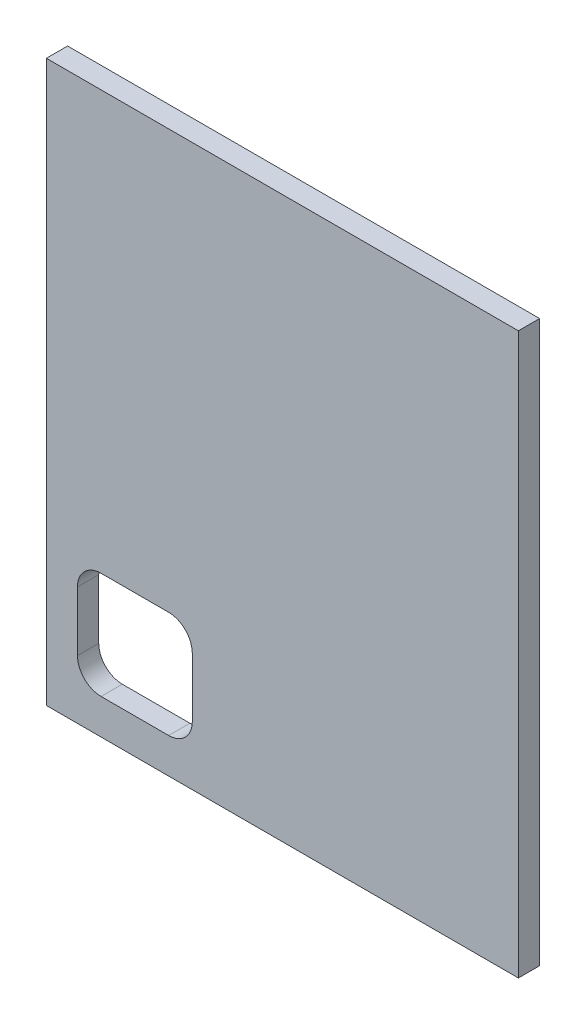
ISO-10303-21;
HEADER;
FILE_DESCRIPTION(('STEP AP214'),'2;1');
FILE_NAME('part.step','',(''),(''),'','','');
FILE_SCHEMA(('AUTOMOTIVE_DESIGN { 1 0 10303 214 1 1 1 1 }'));
ENDSEC;
DATA;
#1=APPLICATION_CONTEXT('core data for automotive mechanical design processes');
#2=APPLICATION_PROTOCOL_DEFINITION('international standard','automotive_design',2000,#1);
#3=PRODUCT_CONTEXT('',#1,'mechanical');
#4=PRODUCT('Part','Part','',(#3));
#5=PRODUCT_RELATED_PRODUCT_CATEGORY('part','',(#4));
#6=PRODUCT_DEFINITION_FORMATION('','',#4);
#7=PRODUCT_DEFINITION_CONTEXT('part definition',#1,'design');
#8=PRODUCT_DEFINITION('design','',#6,#7);
#9=PRODUCT_DEFINITION_SHAPE('','',#8);
#10=(LENGTH_UNIT() NAMED_UNIT(*) SI_UNIT(.MILLI.,.METRE.));
#11=(NAMED_UNIT(*) PLANE_ANGLE_UNIT() SI_UNIT($,.RADIAN.));
#12=(NAMED_UNIT(*) SI_UNIT($,.STERADIAN.) SOLID_ANGLE_UNIT());
#13=UNCERTAINTY_MEASURE_WITH_UNIT(LENGTH_MEASURE(1.E-05),#10,'distance_accuracy_value','');
#14=(GEOMETRIC_REPRESENTATION_CONTEXT(3) GLOBAL_UNCERTAINTY_ASSIGNED_CONTEXT((#13)) GLOBAL_UNIT_ASSIGNED_CONTEXT((#10,
#11,#12)) REPRESENTATION_CONTEXT('',''));
#15=CARTESIAN_POINT('',(0.,0.,0.));
#16=DIRECTION('',(0.,0.,1.));
#17=DIRECTION('',(1.,0.,0.));
#18=AXIS2_PLACEMENT_3D('',#15,#16,#17);
#19=CARTESIAN_POINT('',(0.,0.,-2.286));
#20=DIRECTION('',(-1.,0.,0.));
#21=DIRECTION('',(0.,0.,1.));
#22=AXIS2_PLACEMENT_3D('',#19,#20,#21);
#23=PLANE('',#22);
#24=DIRECTION('',(0.,-1.,0.));
#25=VECTOR('',#24,1.);
#26=CARTESIAN_POINT('',(0.,0.,0.));
#27=LINE('',#26,#25);
#28=CARTESIAN_POINT('',(0.,60.325,0.));
#29=VERTEX_POINT('',#28);
#30=CARTESIAN_POINT('',(0.,0.,0.));
#31=VERTEX_POINT('',#30);
#32=EDGE_CURVE('E177',#29,#31,#27,.T.);
#33=ORIENTED_EDGE('',*,*,#32,.F.);
#34=DIRECTION('',(0.,0.,1.));
#35=VECTOR('',#34,1.);
#36=CARTESIAN_POINT('',(0.,60.325,-2.286));
#37=LINE('',#36,#35);
#38=CARTESIAN_POINT('',(0.,60.325,-2.286));
#39=VERTEX_POINT('',#38);
#40=EDGE_CURVE('E11',#39,#29,#37,.T.);
#41=ORIENTED_EDGE('',*,*,#40,.F.);
#42=DIRECTION('',(0.,-1.,0.));
#43=VECTOR('',#42,1.);
#44=CARTESIAN_POINT('',(0.,0.,-2.286));
#45=LINE('',#44,#43);
#46=CARTESIAN_POINT('',(0.,0.,-2.286));
#47=VERTEX_POINT('',#46);
#48=EDGE_CURVE('E189',#39,#47,#45,.T.);
#49=ORIENTED_EDGE('',*,*,#48,.T.);
#50=DIRECTION('',(0.,0.,1.));
#51=VECTOR('',#50,1.);
#52=CARTESIAN_POINT('',(0.,0.,-2.286));
#53=LINE('',#52,#51);
#54=EDGE_CURVE('E34',#47,#31,#53,.T.);
#55=ORIENTED_EDGE('',*,*,#54,.T.);
#56=EDGE_LOOP('',(#33,#41,#49,#55));
#57=FACE_BOUND('',#56,.T.);
#58=ADVANCED_FACE('F31',(#57),#23,.T.);
#59=CARTESIAN_POINT('',(0.,60.325,-2.286));
#60=DIRECTION('',(0.,1.,0.));
#61=DIRECTION('',(0.,0.,1.));
#62=AXIS2_PLACEMENT_3D('',#59,#60,#61);
#63=PLANE('',#62);
#64=DIRECTION('',(-1.,0.,0.));
#65=VECTOR('',#64,1.);
#66=CARTESIAN_POINT('',(0.,60.325,0.));
#67=LINE('',#66,#65);
#68=CARTESIAN_POINT('',(50.8,60.325,0.));
#69=VERTEX_POINT('',#68);
#70=EDGE_CURVE('E193',#69,#29,#67,.T.);
#71=ORIENTED_EDGE('',*,*,#70,.F.);
#72=DIRECTION('',(0.,0.,1.));
#73=VECTOR('',#72,1.);
#74=CARTESIAN_POINT('',(50.8,60.325,-2.286));
#75=LINE('',#74,#73);
#76=CARTESIAN_POINT('',(50.8,60.325,-2.286));
#77=VERTEX_POINT('',#76);
#78=EDGE_CURVE('E39',#77,#69,#75,.T.);
#79=ORIENTED_EDGE('',*,*,#78,.F.);
#80=DIRECTION('',(-1.,0.,0.));
#81=VECTOR('',#80,1.);
#82=CARTESIAN_POINT('',(0.,60.325,-2.286));
#83=LINE('',#82,#81);
#84=EDGE_CURVE('E199',#77,#39,#83,.T.);
#85=ORIENTED_EDGE('',*,*,#84,.T.);
#86=ORIENTED_EDGE('',*,*,#40,.T.);
#87=EDGE_LOOP('',(#71,#79,#85,#86));
#88=FACE_BOUND('',#87,.T.);
#89=ADVANCED_FACE('F225',(#88),#63,.T.);
#90=CARTESIAN_POINT('',(50.8,0.,-2.286));
#91=DIRECTION('',(1.,0.,0.));
#92=DIRECTION('',(0.,0.,-1.));
#93=AXIS2_PLACEMENT_3D('',#90,#91,#92);
#94=PLANE('',#93);
#95=DIRECTION('',(0.,1.,0.));
#96=VECTOR('',#95,1.);
#97=CARTESIAN_POINT('',(50.8,0.,0.));
#98=LINE('',#97,#96);
#99=CARTESIAN_POINT('',(50.8,0.,0.));
#100=VERTEX_POINT('',#99);
#101=EDGE_CURVE('E207',#100,#69,#98,.T.);
#102=ORIENTED_EDGE('',*,*,#101,.F.);
#103=DIRECTION('',(0.,0.,1.));
#104=VECTOR('',#103,1.);
#105=CARTESIAN_POINT('',(50.8,0.,-2.286));
#106=LINE('',#105,#104);
#107=CARTESIAN_POINT('',(50.8,0.,-2.286));
#108=VERTEX_POINT('',#107);
#109=EDGE_CURVE('E212',#108,#100,#106,.T.);
#110=ORIENTED_EDGE('',*,*,#109,.F.);
#111=DIRECTION('',(0.,1.,0.));
#112=VECTOR('',#111,1.);
#113=CARTESIAN_POINT('',(50.8,0.,-2.286));
#114=LINE('',#113,#112);
#115=EDGE_CURVE('E196',#108,#77,#114,.T.);
#116=ORIENTED_EDGE('',*,*,#115,.T.);
#117=ORIENTED_EDGE('',*,*,#78,.T.);
#118=EDGE_LOOP('',(#102,#110,#116,#117));
#119=FACE_BOUND('',#118,.T.);
#120=ADVANCED_FACE('F229',(#119),#94,.T.);
#121=CARTESIAN_POINT('',(0.,0.,-2.286));
#122=DIRECTION('',(0.,-1.,0.));
#123=DIRECTION('',(0.,0.,-1.));
#124=AXIS2_PLACEMENT_3D('',#121,#122,#123);
#125=PLANE('',#124);
#126=DIRECTION('',(1.,0.,0.));
#127=VECTOR('',#126,1.);
#128=CARTESIAN_POINT('',(0.,0.,0.));
#129=LINE('',#128,#127);
#130=EDGE_CURVE('E204',#31,#100,#129,.T.);
#131=ORIENTED_EDGE('',*,*,#130,.F.);
#132=ORIENTED_EDGE('',*,*,#54,.F.);
#133=DIRECTION('',(1.,0.,0.));
#134=VECTOR('',#133,1.);
#135=CARTESIAN_POINT('',(0.,0.,-2.286));
#136=LINE('',#135,#134);
#137=EDGE_CURVE('E192',#47,#108,#136,.T.);
#138=ORIENTED_EDGE('',*,*,#137,.T.);
#139=ORIENTED_EDGE('',*,*,#109,.T.);
#140=EDGE_LOOP('',(#131,#132,#138,#139));
#141=FACE_BOUND('',#140,.T.);
#142=ADVANCED_FACE('F220',(#141),#125,.T.);
#143=CARTESIAN_POINT('',(0.,60.325,-2.286));
#144=DIRECTION('',(0.,0.,-1.));
#145=DIRECTION('',(-1.,0.,0.));
#146=AXIS2_PLACEMENT_3D('',#143,#144,#145);
#147=PLANE('',#146);
#148=CARTESIAN_POINT('',(13.163134915622,12.7248083662196,-2.286));
#149=DIRECTION('',(0.,0.,1.));
#150=DIRECTION('',(-1.,0.,0.));
#151=AXIS2_PLACEMENT_3D('',#148,#149,#150);
#152=CIRCLE('',#151,2.54);
#153=CARTESIAN_POINT('',(15.703134915622,12.7248083662196,-2.286));
#154=VERTEX_POINT('',#153);
#155=CARTESIAN_POINT('',(13.163134915622,15.2648083662196,-2.286));
#156=VERTEX_POINT('',#155);
#157=EDGE_CURVE('E122',#154,#156,#152,.T.);
#158=ORIENTED_EDGE('',*,*,#157,.T.);
#159=DIRECTION('',(-1.,0.,0.));
#160=VECTOR('',#159,1.);
#161=CARTESIAN_POINT('',(5.88686508437798,15.2648083662196,-2.286));
#162=LINE('',#161,#160);
#163=CARTESIAN_POINT('',(5.88686508437798,15.2648083662196,-2.286));
#164=VERTEX_POINT('',#163);
#165=EDGE_CURVE('E131',#156,#164,#162,.T.);
#166=ORIENTED_EDGE('',*,*,#165,.T.);
#167=CARTESIAN_POINT('',(5.88686508437796,12.7248083662196,-2.286));
#168=DIRECTION('',(0.,0.,1.));
#169=DIRECTION('',(-1.,0.,0.));
#170=AXIS2_PLACEMENT_3D('',#167,#168,#169);
#171=CIRCLE('',#170,2.54);
#172=CARTESIAN_POINT('',(3.34686508437796,12.7248083662196,-2.286));
#173=VERTEX_POINT('',#172);
#174=EDGE_CURVE('E47',#164,#173,#171,.T.);
#175=ORIENTED_EDGE('',*,*,#174,.T.);
#176=DIRECTION('',(0.,-1.,0.));
#177=VECTOR('',#176,1.);
#178=CARTESIAN_POINT('',(3.34686508437796,12.7248083662196,-2.286));
#179=LINE('',#178,#177);
#180=CARTESIAN_POINT('',(3.34686508437796,6.32519163378041,-2.286));
#181=VERTEX_POINT('',#180);
#182=EDGE_CURVE('E146',#173,#181,#179,.T.);
#183=ORIENTED_EDGE('',*,*,#182,.T.);
#184=CARTESIAN_POINT('',(5.88686508437796,6.3251916337804,-2.286));
#185=DIRECTION('',(0.,0.,1.));
#186=DIRECTION('',(-1.,0.,0.));
#187=AXIS2_PLACEMENT_3D('',#184,#185,#186);
#188=CIRCLE('',#187,2.54);
#189=CARTESIAN_POINT('',(5.88686508437798,3.7851916337804,-2.286));
#190=VERTEX_POINT('',#189);
#191=EDGE_CURVE('E149',#181,#190,#188,.T.);
#192=ORIENTED_EDGE('',*,*,#191,.T.);
#193=DIRECTION('',(1.,0.,0.));
#194=VECTOR('',#193,1.);
#195=CARTESIAN_POINT('',(5.88686508437798,3.7851916337804,-2.286));
#196=LINE('',#195,#194);
#197=CARTESIAN_POINT('',(13.163134915622,3.7851916337804,-2.286));
#198=VERTEX_POINT('',#197);
#199=EDGE_CURVE('E152',#190,#198,#196,.T.);
#200=ORIENTED_EDGE('',*,*,#199,.T.);
#201=CARTESIAN_POINT('',(13.163134915622,6.3251916337804,-2.286));
#202=DIRECTION('',(0.,0.,1.));
#203=DIRECTION('',(-1.,0.,0.));
#204=AXIS2_PLACEMENT_3D('',#201,#202,#203);
#205=CIRCLE('',#204,2.54);
#206=CARTESIAN_POINT('',(15.703134915622,6.32519163378041,-2.286));
#207=VERTEX_POINT('',#206);
#208=EDGE_CURVE('E155',#198,#207,#205,.T.);
#209=ORIENTED_EDGE('',*,*,#208,.T.);
#210=DIRECTION('',(0.,1.,0.));
#211=VECTOR('',#210,1.);
#212=CARTESIAN_POINT('',(15.703134915622,12.7248083662196,-2.286));
#213=LINE('',#212,#211);
#214=EDGE_CURVE('E128',#207,#154,#213,.T.);
#215=ORIENTED_EDGE('',*,*,#214,.T.);
#216=EDGE_LOOP('',(#158,#166,#175,#183,#192,#200,#209,#215));
#217=FACE_BOUND('',#216,.T.);
#218=ORIENTED_EDGE('',*,*,#48,.F.);
#219=ORIENTED_EDGE('',*,*,#84,.F.);
#220=ORIENTED_EDGE('',*,*,#115,.F.);
#221=ORIENTED_EDGE('',*,*,#137,.F.);
#222=EDGE_LOOP('',(#218,#219,#220,#221));
#223=FACE_BOUND('',#222,.T.);
#224=ADVANCED_FACE('F135',(#217,#223),#147,.T.);
#225=CARTESIAN_POINT('',(0.,60.325,0.));
#226=DIRECTION('',(0.,0.,-1.));
#227=DIRECTION('',(-1.,0.,0.));
#228=AXIS2_PLACEMENT_3D('',#225,#226,#227);
#229=PLANE('',#228);
#230=DIRECTION('',(-1.,0.,0.));
#231=VECTOR('',#230,1.);
#232=CARTESIAN_POINT('',(5.88686508437798,15.2648083662196,0.));
#233=LINE('',#232,#231);
#234=CARTESIAN_POINT('',(13.163134915622,15.2648083662196,0.));
#235=VERTEX_POINT('',#234);
#236=CARTESIAN_POINT('',(5.88686508437798,15.2648083662196,0.));
#237=VERTEX_POINT('',#236);
#238=EDGE_CURVE('E159',#235,#237,#233,.T.);
#239=ORIENTED_EDGE('',*,*,#238,.F.);
#240=CARTESIAN_POINT('',(13.163134915622,12.7248083662196,0.));
#241=DIRECTION('',(0.,0.,1.));
#242=DIRECTION('',(-1.,0.,0.));
#243=AXIS2_PLACEMENT_3D('',#240,#241,#242);
#244=CIRCLE('',#243,2.54);
#245=CARTESIAN_POINT('',(15.703134915622,12.7248083662196,0.));
#246=VERTEX_POINT('',#245);
#247=EDGE_CURVE('E55',#246,#235,#244,.T.);
#248=ORIENTED_EDGE('',*,*,#247,.F.);
#249=DIRECTION('',(0.,1.,0.));
#250=VECTOR('',#249,1.);
#251=CARTESIAN_POINT('',(15.703134915622,12.7248083662196,0.));
#252=LINE('',#251,#250);
#253=CARTESIAN_POINT('',(15.703134915622,6.32519163378041,0.));
#254=VERTEX_POINT('',#253);
#255=EDGE_CURVE('E139',#254,#246,#252,.T.);
#256=ORIENTED_EDGE('',*,*,#255,.F.);
#257=CARTESIAN_POINT('',(13.163134915622,6.3251916337804,0.));
#258=DIRECTION('',(0.,0.,1.));
#259=DIRECTION('',(-1.,0.,0.));
#260=AXIS2_PLACEMENT_3D('',#257,#258,#259);
#261=CIRCLE('',#260,2.54);
#262=CARTESIAN_POINT('',(13.163134915622,3.7851916337804,0.));
#263=VERTEX_POINT('',#262);
#264=EDGE_CURVE('E142',#263,#254,#261,.T.);
#265=ORIENTED_EDGE('',*,*,#264,.F.);
#266=DIRECTION('',(1.,0.,0.));
#267=VECTOR('',#266,1.);
#268=CARTESIAN_POINT('',(5.88686508437798,3.7851916337804,0.));
#269=LINE('',#268,#267);
#270=CARTESIAN_POINT('',(5.88686508437798,3.7851916337804,0.));
#271=VERTEX_POINT('',#270);
#272=EDGE_CURVE('E170',#271,#263,#269,.T.);
#273=ORIENTED_EDGE('',*,*,#272,.F.);
#274=CARTESIAN_POINT('',(5.88686508437796,6.3251916337804,0.));
#275=DIRECTION('',(0.,0.,1.));
#276=DIRECTION('',(-1.,0.,0.));
#277=AXIS2_PLACEMENT_3D('',#274,#275,#276);
#278=CIRCLE('',#277,2.54);
#279=CARTESIAN_POINT('',(3.34686508437796,6.32519163378041,0.));
#280=VERTEX_POINT('',#279);
#281=EDGE_CURVE('E167',#280,#271,#278,.T.);
#282=ORIENTED_EDGE('',*,*,#281,.F.);
#283=DIRECTION('',(0.,-1.,0.));
#284=VECTOR('',#283,1.);
#285=CARTESIAN_POINT('',(3.34686508437796,12.7248083662196,0.));
#286=LINE('',#285,#284);
#287=CARTESIAN_POINT('',(3.34686508437796,12.7248083662196,0.));
#288=VERTEX_POINT('',#287);
#289=EDGE_CURVE('E164',#288,#280,#286,.T.);
#290=ORIENTED_EDGE('',*,*,#289,.F.);
#291=CARTESIAN_POINT('',(5.88686508437796,12.7248083662196,0.));
#292=DIRECTION('',(0.,0.,1.));
#293=DIRECTION('',(-1.,0.,0.));
#294=AXIS2_PLACEMENT_3D('',#291,#292,#293);
#295=CIRCLE('',#294,2.54);
#296=EDGE_CURVE('E161',#237,#288,#295,.T.);
#297=ORIENTED_EDGE('',*,*,#296,.F.);
#298=EDGE_LOOP('',(#239,#248,#256,#265,#273,#282,#290,#297));
#299=FACE_BOUND('',#298,.T.);
#300=ORIENTED_EDGE('',*,*,#32,.T.);
#301=ORIENTED_EDGE('',*,*,#130,.T.);
#302=ORIENTED_EDGE('',*,*,#101,.T.);
#303=ORIENTED_EDGE('',*,*,#70,.T.);
#304=EDGE_LOOP('',(#300,#301,#302,#303));
#305=FACE_BOUND('',#304,.T.);
#306=ADVANCED_FACE('F222',(#299,#305),#229,.F.);
#307=CARTESIAN_POINT('',(13.163134915622,12.7248083662196,-2.286));
#308=DIRECTION('',(0.,0.,1.));
#309=DIRECTION('',(1.,0.,0.));
#310=AXIS2_PLACEMENT_3D('',#307,#308,#309);
#311=CYLINDRICAL_SURFACE('',#310,2.54);
#312=ORIENTED_EDGE('',*,*,#247,.T.);
#313=DIRECTION('',(0.,0.,1.));
#314=VECTOR('',#313,1.);
#315=CARTESIAN_POINT('',(13.163134915622,15.2648083662196,-2.286));
#316=LINE('',#315,#314);
#317=EDGE_CURVE('E118',#156,#235,#316,.T.);
#318=ORIENTED_EDGE('',*,*,#317,.F.);
#319=ORIENTED_EDGE('',*,*,#157,.F.);
#320=DIRECTION('',(0.,0.,1.));
#321=VECTOR('',#320,1.);
#322=CARTESIAN_POINT('',(15.703134915622,12.7248083662196,-2.286));
#323=LINE('',#322,#321);
#324=EDGE_CURVE('E175',#154,#246,#323,.T.);
#325=ORIENTED_EDGE('',*,*,#324,.T.);
#326=EDGE_LOOP('',(#312,#318,#319,#325));
#327=FACE_BOUND('',#326,.T.);
#328=ADVANCED_FACE('F120',(#327),#311,.F.);
#329=CARTESIAN_POINT('',(15.703134915622,12.7248083662196,-2.286));
#330=DIRECTION('',(1.,0.,0.));
#331=DIRECTION('',(0.,0.,-1.));
#332=AXIS2_PLACEMENT_3D('',#329,#330,#331);
#333=PLANE('',#332);
#334=ORIENTED_EDGE('',*,*,#255,.T.);
#335=ORIENTED_EDGE('',*,*,#324,.F.);
#336=ORIENTED_EDGE('',*,*,#214,.F.);
#337=DIRECTION('',(0.,0.,1.));
#338=VECTOR('',#337,1.);
#339=CARTESIAN_POINT('',(15.703134915622,6.32519163378041,-2.286));
#340=LINE('',#339,#338);
#341=EDGE_CURVE('E178',#207,#254,#340,.T.);
#342=ORIENTED_EDGE('',*,*,#341,.T.);
#343=EDGE_LOOP('',(#334,#335,#336,#342));
#344=FACE_BOUND('',#343,.T.);
#345=ADVANCED_FACE('F280',(#344),#333,.F.);
#346=CARTESIAN_POINT('',(13.163134915622,6.3251916337804,-2.286));
#347=DIRECTION('',(0.,0.,1.));
#348=DIRECTION('',(1.,0.,0.));
#349=AXIS2_PLACEMENT_3D('',#346,#347,#348);
#350=CYLINDRICAL_SURFACE('',#349,2.54);
#351=ORIENTED_EDGE('',*,*,#264,.T.);
#352=ORIENTED_EDGE('',*,*,#341,.F.);
#353=ORIENTED_EDGE('',*,*,#208,.F.);
#354=DIRECTION('',(0.,0.,1.));
#355=VECTOR('',#354,1.);
#356=CARTESIAN_POINT('',(13.163134915622,3.7851916337804,-2.286));
#357=LINE('',#356,#355);
#358=EDGE_CURVE('E180',#198,#263,#357,.T.);
#359=ORIENTED_EDGE('',*,*,#358,.T.);
#360=EDGE_LOOP('',(#351,#352,#353,#359));
#361=FACE_BOUND('',#360,.T.);
#362=ADVANCED_FACE('F289',(#361),#350,.F.);
#363=CARTESIAN_POINT('',(5.88686508437798,3.7851916337804,-2.286));
#364=DIRECTION('',(0.,-1.,0.));
#365=DIRECTION('',(0.,0.,-1.));
#366=AXIS2_PLACEMENT_3D('',#363,#364,#365);
#367=PLANE('',#366);
#368=ORIENTED_EDGE('',*,*,#272,.T.);
#369=ORIENTED_EDGE('',*,*,#358,.F.);
#370=ORIENTED_EDGE('',*,*,#199,.F.);
#371=DIRECTION('',(0.,0.,1.));
#372=VECTOR('',#371,1.);
#373=CARTESIAN_POINT('',(5.88686508437798,3.7851916337804,-2.286));
#374=LINE('',#373,#372);
#375=EDGE_CURVE('E182',#190,#271,#374,.T.);
#376=ORIENTED_EDGE('',*,*,#375,.T.);
#377=EDGE_LOOP('',(#368,#369,#370,#376));
#378=FACE_BOUND('',#377,.T.);
#379=ADVANCED_FACE('F299',(#378),#367,.F.);
#380=CARTESIAN_POINT('',(5.88686508437796,6.3251916337804,-2.286));
#381=DIRECTION('',(0.,0.,1.));
#382=DIRECTION('',(1.,0.,0.));
#383=AXIS2_PLACEMENT_3D('',#380,#381,#382);
#384=CYLINDRICAL_SURFACE('',#383,2.54);
#385=ORIENTED_EDGE('',*,*,#281,.T.);
#386=ORIENTED_EDGE('',*,*,#375,.F.);
#387=ORIENTED_EDGE('',*,*,#191,.F.);
#388=DIRECTION('',(0.,0.,1.));
#389=VECTOR('',#388,1.);
#390=CARTESIAN_POINT('',(3.34686508437796,6.32519163378041,-2.286));
#391=LINE('',#390,#389);
#392=EDGE_CURVE('E184',#181,#280,#391,.T.);
#393=ORIENTED_EDGE('',*,*,#392,.T.);
#394=EDGE_LOOP('',(#385,#386,#387,#393));
#395=FACE_BOUND('',#394,.T.);
#396=ADVANCED_FACE('F309',(#395),#384,.F.);
#397=CARTESIAN_POINT('',(3.34686508437796,12.7248083662196,-2.286));
#398=DIRECTION('',(-1.,0.,0.));
#399=DIRECTION('',(0.,0.,1.));
#400=AXIS2_PLACEMENT_3D('',#397,#398,#399);
#401=PLANE('',#400);
#402=ORIENTED_EDGE('',*,*,#289,.T.);
#403=ORIENTED_EDGE('',*,*,#392,.F.);
#404=ORIENTED_EDGE('',*,*,#182,.F.);
#405=DIRECTION('',(0.,0.,1.));
#406=VECTOR('',#405,1.);
#407=CARTESIAN_POINT('',(3.34686508437796,12.7248083662196,-2.286));
#408=LINE('',#407,#406);
#409=EDGE_CURVE('E186',#173,#288,#408,.T.);
#410=ORIENTED_EDGE('',*,*,#409,.T.);
#411=EDGE_LOOP('',(#402,#403,#404,#410));
#412=FACE_BOUND('',#411,.T.);
#413=ADVANCED_FACE('F319',(#412),#401,.F.);
#414=CARTESIAN_POINT('',(5.88686508437796,12.7248083662196,-2.286));
#415=DIRECTION('',(0.,0.,1.));
#416=DIRECTION('',(1.,0.,0.));
#417=AXIS2_PLACEMENT_3D('',#414,#415,#416);
#418=CYLINDRICAL_SURFACE('',#417,2.54);
#419=ORIENTED_EDGE('',*,*,#296,.T.);
#420=ORIENTED_EDGE('',*,*,#409,.F.);
#421=ORIENTED_EDGE('',*,*,#174,.F.);
#422=DIRECTION('',(0.,0.,1.));
#423=VECTOR('',#422,1.);
#424=CARTESIAN_POINT('',(5.88686508437798,15.2648083662196,-2.286));
#425=LINE('',#424,#423);
#426=EDGE_CURVE('E127',#164,#237,#425,.T.);
#427=ORIENTED_EDGE('',*,*,#426,.T.);
#428=EDGE_LOOP('',(#419,#420,#421,#427));
#429=FACE_BOUND('',#428,.T.);
#430=ADVANCED_FACE('F329',(#429),#418,.F.);
#431=CARTESIAN_POINT('',(5.88686508437798,15.2648083662196,-2.286));
#432=DIRECTION('',(0.,1.,0.));
#433=DIRECTION('',(0.,0.,1.));
#434=AXIS2_PLACEMENT_3D('',#431,#432,#433);
#435=PLANE('',#434);
#436=ORIENTED_EDGE('',*,*,#238,.T.);
#437=ORIENTED_EDGE('',*,*,#426,.F.);
#438=ORIENTED_EDGE('',*,*,#165,.F.);
#439=ORIENTED_EDGE('',*,*,#317,.T.);
#440=EDGE_LOOP('',(#436,#437,#438,#439));
#441=FACE_BOUND('',#440,.T.);
#442=ADVANCED_FACE('F132',(#441),#435,.F.);
#443=CLOSED_SHELL('',(#58,#89,#120,#142,#224,#306,#328,#345,#362,#379,#396,#413,#430,#442));
#444=MANIFOLD_SOLID_BREP('B2',#443);
#445=ADVANCED_BREP_SHAPE_REPRESENTATION('',(#18,#444),#14);
#446=SHAPE_DEFINITION_REPRESENTATION(#9,#445);
ENDSEC;
END-ISO-10303-21;
